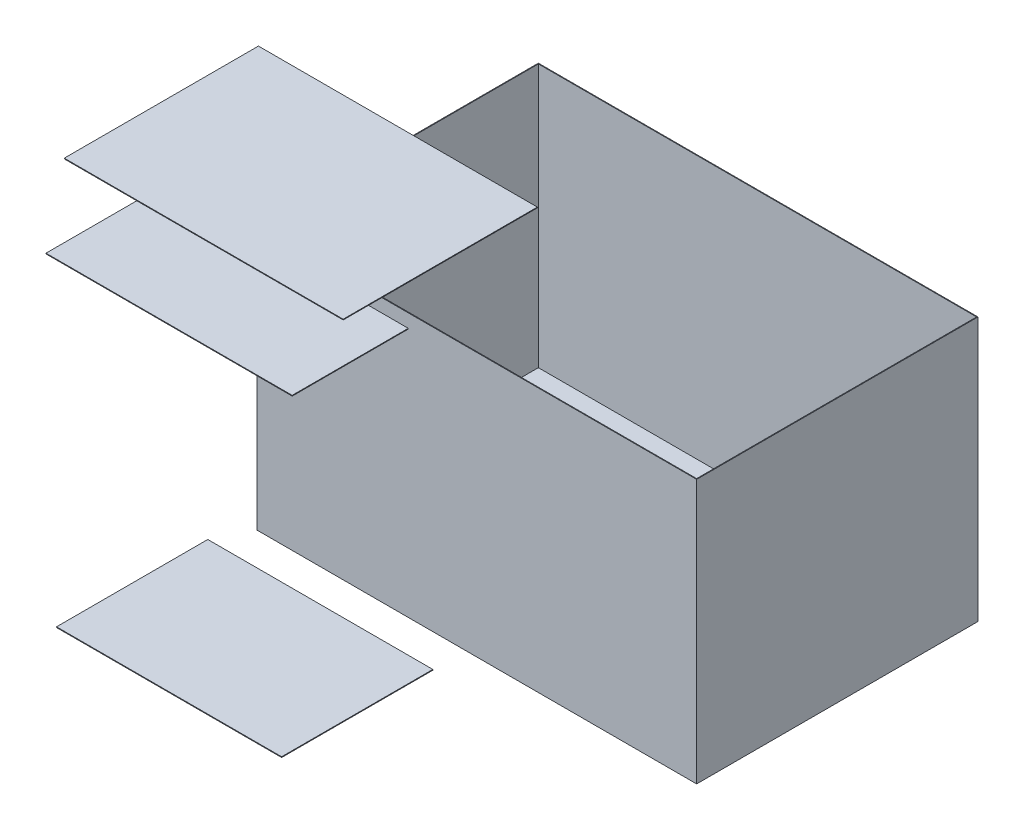
ISO-10303-21;
HEADER;
FILE_DESCRIPTION(('STEP AP214'),'2;1');
FILE_NAME('part.step','',(''),(''),'','','');
FILE_SCHEMA(('AUTOMOTIVE_DESIGN { 1 0 10303 214 1 1 1 1 }'));
ENDSEC;
DATA;
#1=APPLICATION_CONTEXT('core data for automotive mechanical design processes');
#2=APPLICATION_PROTOCOL_DEFINITION('international standard','automotive_design',2000,#1);
#3=PRODUCT_CONTEXT('',#1,'mechanical');
#4=PRODUCT('Part','Part','',(#3));
#5=PRODUCT_RELATED_PRODUCT_CATEGORY('part','',(#4));
#6=PRODUCT_DEFINITION_FORMATION('','',#4);
#7=PRODUCT_DEFINITION_CONTEXT('part definition',#1,'design');
#8=PRODUCT_DEFINITION('design','',#6,#7);
#9=PRODUCT_DEFINITION_SHAPE('','',#8);
#10=(LENGTH_UNIT() NAMED_UNIT(*) SI_UNIT(.MILLI.,.METRE.));
#11=(NAMED_UNIT(*) PLANE_ANGLE_UNIT() SI_UNIT($,.RADIAN.));
#12=(NAMED_UNIT(*) SI_UNIT($,.STERADIAN.) SOLID_ANGLE_UNIT());
#13=UNCERTAINTY_MEASURE_WITH_UNIT(LENGTH_MEASURE(1.E-05),#10,'distance_accuracy_value','');
#14=(GEOMETRIC_REPRESENTATION_CONTEXT(3) GLOBAL_UNCERTAINTY_ASSIGNED_CONTEXT((#13)) GLOBAL_UNIT_ASSIGNED_CONTEXT((#10,
#11,#12)) REPRESENTATION_CONTEXT('',''));
#15=CARTESIAN_POINT('',(0.,0.,0.));
#16=DIRECTION('',(0.,0.,1.));
#17=DIRECTION('',(1.,0.,0.));
#18=AXIS2_PLACEMENT_3D('',#15,#16,#17);
#19=CARTESIAN_POINT('',(2.,1192.,-2.));
#20=DIRECTION('',(1.,0.,0.));
#21=DIRECTION('',(0.,0.,-1.));
#22=AXIS2_PLACEMENT_3D('',#19,#20,#21);
#23=PLANE('',#22);
#24=DIRECTION('',(0.,0.,1.));
#25=VECTOR('',#24,1.);
#26=CARTESIAN_POINT('',(2.,1190.,-2.));
#27=LINE('',#26,#25);
#28=CARTESIAN_POINT('',(2.,1190.,-2.));
#29=VERTEX_POINT('',#28);
#30=CARTESIAN_POINT('',(2.,1190.,550.));
#31=VERTEX_POINT('',#30);
#32=EDGE_CURVE('E119',#29,#31,#27,.T.);
#33=ORIENTED_EDGE('',*,*,#32,.T.);
#34=DIRECTION('',(0.,-1.,0.));
#35=VECTOR('',#34,1.);
#36=CARTESIAN_POINT('',(2.,1192.,550.));
#37=LINE('',#36,#35);
#38=CARTESIAN_POINT('',(2.,1192.,550.));
#39=VERTEX_POINT('',#38);
#40=EDGE_CURVE('E12',#39,#31,#37,.T.);
#41=ORIENTED_EDGE('',*,*,#40,.F.);
#42=DIRECTION('',(0.,0.,1.));
#43=VECTOR('',#42,1.);
#44=CARTESIAN_POINT('',(2.,1192.,-2.));
#45=LINE('',#44,#43);
#46=CARTESIAN_POINT('',(2.,1192.,-2.));
#47=VERTEX_POINT('',#46);
#48=EDGE_CURVE('E104',#47,#39,#45,.T.);
#49=ORIENTED_EDGE('',*,*,#48,.F.);
#50=DIRECTION('',(0.,-1.,0.));
#51=VECTOR('',#50,1.);
#52=CARTESIAN_POINT('',(2.,1192.,-2.));
#53=LINE('',#52,#51);
#54=EDGE_CURVE('E114',#47,#29,#53,.T.);
#55=ORIENTED_EDGE('',*,*,#54,.T.);
#56=EDGE_LOOP('',(#33,#41,#49,#55));
#57=FACE_BOUND('',#56,.T.);
#58=ADVANCED_FACE('F53',(#57),#23,.F.);
#59=CARTESIAN_POINT('',(2.,1192.,550.));
#60=DIRECTION('',(0.,0.,-1.));
#61=DIRECTION('',(-1.,0.,0.));
#62=AXIS2_PLACEMENT_3D('',#59,#60,#61);
#63=PLANE('',#62);
#64=DIRECTION('',(1.,0.,0.));
#65=VECTOR('',#64,1.);
#66=CARTESIAN_POINT('',(2.,1190.,550.));
#67=LINE('',#66,#65);
#68=CARTESIAN_POINT('',(795.,1190.,550.));
#69=VERTEX_POINT('',#68);
#70=EDGE_CURVE('E108',#31,#69,#67,.T.);
#71=ORIENTED_EDGE('',*,*,#70,.T.);
#72=DIRECTION('',(0.,-1.,0.));
#73=VECTOR('',#72,1.);
#74=CARTESIAN_POINT('',(795.,1192.,550.));
#75=LINE('',#74,#73);
#76=CARTESIAN_POINT('',(795.,1192.,550.));
#77=VERTEX_POINT('',#76);
#78=EDGE_CURVE('E64',#77,#69,#75,.T.);
#79=ORIENTED_EDGE('',*,*,#78,.F.);
#80=DIRECTION('',(1.,0.,0.));
#81=VECTOR('',#80,1.);
#82=CARTESIAN_POINT('',(2.,1192.,550.));
#83=LINE('',#82,#81);
#84=EDGE_CURVE('E99',#39,#77,#83,.T.);
#85=ORIENTED_EDGE('',*,*,#84,.F.);
#86=ORIENTED_EDGE('',*,*,#40,.T.);
#87=EDGE_LOOP('',(#71,#79,#85,#86));
#88=FACE_BOUND('',#87,.T.);
#89=ADVANCED_FACE('F107',(#88),#63,.F.);
#90=CARTESIAN_POINT('',(795.,1192.,-2.));
#91=DIRECTION('',(-1.,0.,0.));
#92=DIRECTION('',(0.,0.,1.));
#93=AXIS2_PLACEMENT_3D('',#90,#91,#92);
#94=PLANE('',#93);
#95=DIRECTION('',(0.,0.,-1.));
#96=VECTOR('',#95,1.);
#97=CARTESIAN_POINT('',(795.,1190.,-2.));
#98=LINE('',#97,#96);
#99=CARTESIAN_POINT('',(795.,1190.,-2.));
#100=VERTEX_POINT('',#99);
#101=EDGE_CURVE('E87',#69,#100,#98,.T.);
#102=ORIENTED_EDGE('',*,*,#101,.T.);
#103=DIRECTION('',(0.,-1.,0.));
#104=VECTOR('',#103,1.);
#105=CARTESIAN_POINT('',(795.,1192.,-2.));
#106=LINE('',#105,#104);
#107=CARTESIAN_POINT('',(795.,1192.,-2.));
#108=VERTEX_POINT('',#107);
#109=EDGE_CURVE('E109',#108,#100,#106,.T.);
#110=ORIENTED_EDGE('',*,*,#109,.F.);
#111=DIRECTION('',(0.,0.,-1.));
#112=VECTOR('',#111,1.);
#113=CARTESIAN_POINT('',(795.,1192.,-2.));
#114=LINE('',#113,#112);
#115=EDGE_CURVE('E103',#77,#108,#114,.T.);
#116=ORIENTED_EDGE('',*,*,#115,.F.);
#117=ORIENTED_EDGE('',*,*,#78,.T.);
#118=EDGE_LOOP('',(#102,#110,#116,#117));
#119=FACE_BOUND('',#118,.T.);
#120=ADVANCED_FACE('F112',(#119),#94,.F.);
#121=CARTESIAN_POINT('',(2.,1192.,-2.));
#122=DIRECTION('',(0.,0.,1.));
#123=DIRECTION('',(1.,0.,0.));
#124=AXIS2_PLACEMENT_3D('',#121,#122,#123);
#125=PLANE('',#124);
#126=DIRECTION('',(-1.,0.,0.));
#127=VECTOR('',#126,1.);
#128=CARTESIAN_POINT('',(2.,1190.,-2.));
#129=LINE('',#128,#127);
#130=EDGE_CURVE('E91',#100,#29,#129,.T.);
#131=ORIENTED_EDGE('',*,*,#130,.T.);
#132=ORIENTED_EDGE('',*,*,#54,.F.);
#133=DIRECTION('',(-1.,0.,0.));
#134=VECTOR('',#133,1.);
#135=CARTESIAN_POINT('',(2.,1192.,-2.));
#136=LINE('',#135,#134);
#137=EDGE_CURVE('E67',#108,#47,#136,.T.);
#138=ORIENTED_EDGE('',*,*,#137,.F.);
#139=ORIENTED_EDGE('',*,*,#109,.T.);
#140=EDGE_LOOP('',(#131,#132,#138,#139));
#141=FACE_BOUND('',#140,.T.);
#142=ADVANCED_FACE('F123',(#141),#125,.F.);
#143=CARTESIAN_POINT('',(0.,1192.,0.));
#144=DIRECTION('',(0.,1.,0.));
#145=DIRECTION('',(0.,0.,1.));
#146=AXIS2_PLACEMENT_3D('',#143,#144,#145);
#147=PLANE('',#146);
#148=ORIENTED_EDGE('',*,*,#48,.T.);
#149=ORIENTED_EDGE('',*,*,#84,.T.);
#150=ORIENTED_EDGE('',*,*,#115,.T.);
#151=ORIENTED_EDGE('',*,*,#137,.T.);
#152=EDGE_LOOP('',(#148,#149,#150,#151));
#153=FACE_BOUND('',#152,.T.);
#154=ADVANCED_FACE('F101',(#153),#147,.T.);
#155=CARTESIAN_POINT('',(0.,1190.,0.));
#156=DIRECTION('',(0.,1.,0.));
#157=DIRECTION('',(0.,0.,1.));
#158=AXIS2_PLACEMENT_3D('',#155,#156,#157);
#159=PLANE('',#158);
#160=ORIENTED_EDGE('',*,*,#32,.F.);
#161=ORIENTED_EDGE('',*,*,#130,.F.);
#162=ORIENTED_EDGE('',*,*,#101,.F.);
#163=ORIENTED_EDGE('',*,*,#70,.F.);
#164=EDGE_LOOP('',(#160,#161,#162,#163));
#165=FACE_BOUND('',#164,.T.);
#166=ADVANCED_FACE('F130',(#165),#159,.F.);
#167=CLOSED_SHELL('',(#58,#89,#120,#142,#154,#166));
#168=MANIFOLD_SOLID_BREP('B2',#167);
#169=CARTESIAN_POINT('',(50.,1032.,320.));
#170=DIRECTION('',(1.,0.,0.));
#171=DIRECTION('',(0.,0.,-1.));
#172=AXIS2_PLACEMENT_3D('',#169,#170,#171);
#173=PLANE('',#172);
#174=DIRECTION('',(0.,0.,1.));
#175=VECTOR('',#174,1.);
#176=CARTESIAN_POINT('',(50.,1030.,320.));
#177=LINE('',#176,#175);
#178=CARTESIAN_POINT('',(50.,1030.,320.));
#179=VERTEX_POINT('',#178);
#180=CARTESIAN_POINT('',(50.,1030.,650.));
#181=VERTEX_POINT('',#180);
#182=EDGE_CURVE('E253',#179,#181,#177,.T.);
#183=ORIENTED_EDGE('',*,*,#182,.T.);
#184=DIRECTION('',(0.,-1.,0.));
#185=VECTOR('',#184,1.);
#186=CARTESIAN_POINT('',(50.,1032.,650.));
#187=LINE('',#186,#185);
#188=CARTESIAN_POINT('',(50.,1032.,650.));
#189=VERTEX_POINT('',#188);
#190=EDGE_CURVE('E55',#189,#181,#187,.T.);
#191=ORIENTED_EDGE('',*,*,#190,.F.);
#192=DIRECTION('',(0.,0.,1.));
#193=VECTOR('',#192,1.);
#194=CARTESIAN_POINT('',(50.,1032.,320.));
#195=LINE('',#194,#193);
#196=CARTESIAN_POINT('',(50.,1032.,320.));
#197=VERTEX_POINT('',#196);
#198=EDGE_CURVE('E239',#197,#189,#195,.T.);
#199=ORIENTED_EDGE('',*,*,#198,.F.);
#200=DIRECTION('',(0.,-1.,0.));
#201=VECTOR('',#200,1.);
#202=CARTESIAN_POINT('',(50.,1032.,320.));
#203=LINE('',#202,#201);
#204=EDGE_CURVE('E246',#197,#179,#203,.T.);
#205=ORIENTED_EDGE('',*,*,#204,.T.);
#206=EDGE_LOOP('',(#183,#191,#199,#205));
#207=FACE_BOUND('',#206,.T.);
#208=ADVANCED_FACE('F190',(#207),#173,.F.);
#209=CARTESIAN_POINT('',(50.,1032.,650.));
#210=DIRECTION('',(0.,0.,-1.));
#211=DIRECTION('',(-1.,0.,0.));
#212=AXIS2_PLACEMENT_3D('',#209,#210,#211);
#213=PLANE('',#212);
#214=DIRECTION('',(1.,0.,0.));
#215=VECTOR('',#214,1.);
#216=CARTESIAN_POINT('',(50.,1030.,650.));
#217=LINE('',#216,#215);
#218=CARTESIAN_POINT('',(750.,1030.,650.));
#219=VERTEX_POINT('',#218);
#220=EDGE_CURVE('E245',#181,#219,#217,.T.);
#221=ORIENTED_EDGE('',*,*,#220,.T.);
#222=DIRECTION('',(0.,-1.,0.));
#223=VECTOR('',#222,1.);
#224=CARTESIAN_POINT('',(750.,1032.,650.));
#225=LINE('',#224,#223);
#226=CARTESIAN_POINT('',(750.,1032.,650.));
#227=VERTEX_POINT('',#226);
#228=EDGE_CURVE('E198',#227,#219,#225,.T.);
#229=ORIENTED_EDGE('',*,*,#228,.F.);
#230=DIRECTION('',(1.,0.,0.));
#231=VECTOR('',#230,1.);
#232=CARTESIAN_POINT('',(50.,1032.,650.));
#233=LINE('',#232,#231);
#234=EDGE_CURVE('E233',#189,#227,#233,.T.);
#235=ORIENTED_EDGE('',*,*,#234,.F.);
#236=ORIENTED_EDGE('',*,*,#190,.T.);
#237=EDGE_LOOP('',(#221,#229,#235,#236));
#238=FACE_BOUND('',#237,.T.);
#239=ADVANCED_FACE('F244',(#238),#213,.F.);
#240=CARTESIAN_POINT('',(750.,1032.,320.));
#241=DIRECTION('',(-1.,0.,0.));
#242=DIRECTION('',(0.,0.,1.));
#243=AXIS2_PLACEMENT_3D('',#240,#241,#242);
#244=PLANE('',#243);
#245=DIRECTION('',(0.,0.,-1.));
#246=VECTOR('',#245,1.);
#247=CARTESIAN_POINT('',(750.,1030.,320.));
#248=LINE('',#247,#246);
#249=CARTESIAN_POINT('',(750.,1030.,320.));
#250=VERTEX_POINT('',#249);
#251=EDGE_CURVE('E222',#219,#250,#248,.T.);
#252=ORIENTED_EDGE('',*,*,#251,.T.);
#253=DIRECTION('',(0.,-1.,0.));
#254=VECTOR('',#253,1.);
#255=CARTESIAN_POINT('',(750.,1032.,320.));
#256=LINE('',#255,#254);
#257=CARTESIAN_POINT('',(750.,1032.,320.));
#258=VERTEX_POINT('',#257);
#259=EDGE_CURVE('E241',#258,#250,#256,.T.);
#260=ORIENTED_EDGE('',*,*,#259,.F.);
#261=DIRECTION('',(0.,0.,-1.));
#262=VECTOR('',#261,1.);
#263=CARTESIAN_POINT('',(750.,1032.,320.));
#264=LINE('',#263,#262);
#265=EDGE_CURVE('E240',#227,#258,#264,.T.);
#266=ORIENTED_EDGE('',*,*,#265,.F.);
#267=ORIENTED_EDGE('',*,*,#228,.T.);
#268=EDGE_LOOP('',(#252,#260,#266,#267));
#269=FACE_BOUND('',#268,.T.);
#270=ADVANCED_FACE('F243',(#269),#244,.F.);
#271=CARTESIAN_POINT('',(50.,1032.,320.));
#272=DIRECTION('',(0.,0.,1.));
#273=DIRECTION('',(1.,0.,0.));
#274=AXIS2_PLACEMENT_3D('',#271,#272,#273);
#275=PLANE('',#274);
#276=DIRECTION('',(-1.,0.,0.));
#277=VECTOR('',#276,1.);
#278=CARTESIAN_POINT('',(50.,1030.,320.));
#279=LINE('',#278,#277);
#280=EDGE_CURVE('E229',#250,#179,#279,.T.);
#281=ORIENTED_EDGE('',*,*,#280,.T.);
#282=ORIENTED_EDGE('',*,*,#204,.F.);
#283=DIRECTION('',(-1.,0.,0.));
#284=VECTOR('',#283,1.);
#285=CARTESIAN_POINT('',(50.,1032.,320.));
#286=LINE('',#285,#284);
#287=EDGE_CURVE('E204',#258,#197,#286,.T.);
#288=ORIENTED_EDGE('',*,*,#287,.F.);
#289=ORIENTED_EDGE('',*,*,#259,.T.);
#290=EDGE_LOOP('',(#281,#282,#288,#289));
#291=FACE_BOUND('',#290,.T.);
#292=ADVANCED_FACE('F256',(#291),#275,.F.);
#293=CARTESIAN_POINT('',(0.,1032.,0.));
#294=DIRECTION('',(0.,1.,0.));
#295=DIRECTION('',(0.,0.,1.));
#296=AXIS2_PLACEMENT_3D('',#293,#294,#295);
#297=PLANE('',#296);
#298=ORIENTED_EDGE('',*,*,#198,.T.);
#299=ORIENTED_EDGE('',*,*,#234,.T.);
#300=ORIENTED_EDGE('',*,*,#265,.T.);
#301=ORIENTED_EDGE('',*,*,#287,.T.);
#302=EDGE_LOOP('',(#298,#299,#300,#301));
#303=FACE_BOUND('',#302,.T.);
#304=ADVANCED_FACE('F232',(#303),#297,.T.);
#305=CARTESIAN_POINT('',(0.,1030.,0.));
#306=DIRECTION('',(0.,1.,0.));
#307=DIRECTION('',(0.,0.,1.));
#308=AXIS2_PLACEMENT_3D('',#305,#306,#307);
#309=PLANE('',#308);
#310=ORIENTED_EDGE('',*,*,#182,.F.);
#311=ORIENTED_EDGE('',*,*,#280,.F.);
#312=ORIENTED_EDGE('',*,*,#251,.F.);
#313=ORIENTED_EDGE('',*,*,#220,.F.);
#314=EDGE_LOOP('',(#310,#311,#312,#313));
#315=FACE_BOUND('',#314,.T.);
#316=ADVANCED_FACE('F261',(#315),#309,.F.);
#317=CLOSED_SHELL('',(#208,#239,#270,#292,#304,#316));
#318=MANIFOLD_SOLID_BREP('B6',#317);
#319=CARTESIAN_POINT('',(80.,127.,220.));
#320=DIRECTION('',(1.,0.,0.));
#321=DIRECTION('',(0.,0.,-1.));
#322=AXIS2_PLACEMENT_3D('',#319,#320,#321);
#323=PLANE('',#322);
#324=DIRECTION('',(0.,0.,1.));
#325=VECTOR('',#324,1.);
#326=CARTESIAN_POINT('',(80.,125.,220.));
#327=LINE('',#326,#325);
#328=CARTESIAN_POINT('',(80.,125.,220.));
#329=VERTEX_POINT('',#328);
#330=CARTESIAN_POINT('',(80.,125.,650.));
#331=VERTEX_POINT('',#330);
#332=EDGE_CURVE('E383',#329,#331,#327,.T.);
#333=ORIENTED_EDGE('',*,*,#332,.T.);
#334=DIRECTION('',(0.,-1.,0.));
#335=VECTOR('',#334,1.);
#336=CARTESIAN_POINT('',(80.,127.,650.));
#337=LINE('',#336,#335);
#338=CARTESIAN_POINT('',(80.,127.,650.));
#339=VERTEX_POINT('',#338);
#340=EDGE_CURVE('E187',#339,#331,#337,.T.);
#341=ORIENTED_EDGE('',*,*,#340,.F.);
#342=DIRECTION('',(0.,0.,1.));
#343=VECTOR('',#342,1.);
#344=CARTESIAN_POINT('',(80.,127.,220.));
#345=LINE('',#344,#343);
#346=CARTESIAN_POINT('',(80.,127.,220.));
#347=VERTEX_POINT('',#346);
#348=EDGE_CURVE('E375',#347,#339,#345,.T.);
#349=ORIENTED_EDGE('',*,*,#348,.F.);
#350=DIRECTION('',(0.,-1.,0.));
#351=VECTOR('',#350,1.);
#352=CARTESIAN_POINT('',(80.,127.,220.));
#353=LINE('',#352,#351);
#354=EDGE_CURVE('E379',#347,#329,#353,.T.);
#355=ORIENTED_EDGE('',*,*,#354,.T.);
#356=EDGE_LOOP('',(#333,#341,#349,#355));
#357=FACE_BOUND('',#356,.T.);
#358=ADVANCED_FACE('F321',(#357),#323,.F.);
#359=CARTESIAN_POINT('',(80.,127.,650.));
#360=DIRECTION('',(0.,0.,-1.));
#361=DIRECTION('',(-1.,0.,0.));
#362=AXIS2_PLACEMENT_3D('',#359,#360,#361);
#363=PLANE('',#362);
#364=DIRECTION('',(1.,0.,0.));
#365=VECTOR('',#364,1.);
#366=CARTESIAN_POINT('',(80.,125.,650.));
#367=LINE('',#366,#365);
#368=CARTESIAN_POINT('',(720.,125.,650.));
#369=VERTEX_POINT('',#368);
#370=EDGE_CURVE('E376',#331,#369,#367,.T.);
#371=ORIENTED_EDGE('',*,*,#370,.T.);
#372=DIRECTION('',(0.,-1.,0.));
#373=VECTOR('',#372,1.);
#374=CARTESIAN_POINT('',(720.,127.,650.));
#375=LINE('',#374,#373);
#376=CARTESIAN_POINT('',(720.,127.,650.));
#377=VERTEX_POINT('',#376);
#378=EDGE_CURVE('E328',#377,#369,#375,.T.);
#379=ORIENTED_EDGE('',*,*,#378,.F.);
#380=DIRECTION('',(1.,0.,0.));
#381=VECTOR('',#380,1.);
#382=CARTESIAN_POINT('',(80.,127.,650.));
#383=LINE('',#382,#381);
#384=EDGE_CURVE('E370',#339,#377,#383,.T.);
#385=ORIENTED_EDGE('',*,*,#384,.F.);
#386=ORIENTED_EDGE('',*,*,#340,.T.);
#387=EDGE_LOOP('',(#371,#379,#385,#386));
#388=FACE_BOUND('',#387,.T.);
#389=ADVANCED_FACE('F374',(#388),#363,.F.);
#390=CARTESIAN_POINT('',(720.,127.,220.));
#391=DIRECTION('',(-1.,0.,0.));
#392=DIRECTION('',(0.,0.,1.));
#393=AXIS2_PLACEMENT_3D('',#390,#391,#392);
#394=PLANE('',#393);
#395=DIRECTION('',(0.,0.,-1.));
#396=VECTOR('',#395,1.);
#397=CARTESIAN_POINT('',(720.,125.,220.));
#398=LINE('',#397,#396);
#399=CARTESIAN_POINT('',(720.,125.,220.));
#400=VERTEX_POINT('',#399);
#401=EDGE_CURVE('E351',#369,#400,#398,.T.);
#402=ORIENTED_EDGE('',*,*,#401,.T.);
#403=DIRECTION('',(0.,-1.,0.));
#404=VECTOR('',#403,1.);
#405=CARTESIAN_POINT('',(720.,127.,220.));
#406=LINE('',#405,#404);
#407=CARTESIAN_POINT('',(720.,127.,220.));
#408=VERTEX_POINT('',#407);
#409=EDGE_CURVE('E380',#408,#400,#406,.T.);
#410=ORIENTED_EDGE('',*,*,#409,.F.);
#411=DIRECTION('',(0.,0.,-1.));
#412=VECTOR('',#411,1.);
#413=CARTESIAN_POINT('',(720.,127.,220.));
#414=LINE('',#413,#412);
#415=EDGE_CURVE('E367',#377,#408,#414,.T.);
#416=ORIENTED_EDGE('',*,*,#415,.F.);
#417=ORIENTED_EDGE('',*,*,#378,.T.);
#418=EDGE_LOOP('',(#402,#410,#416,#417));
#419=FACE_BOUND('',#418,.T.);
#420=ADVANCED_FACE('F378',(#419),#394,.F.);
#421=CARTESIAN_POINT('',(80.,127.,220.));
#422=DIRECTION('',(0.,0.,1.));
#423=DIRECTION('',(1.,0.,0.));
#424=AXIS2_PLACEMENT_3D('',#421,#422,#423);
#425=PLANE('',#424);
#426=DIRECTION('',(-1.,0.,0.));
#427=VECTOR('',#426,1.);
#428=CARTESIAN_POINT('',(80.,125.,220.));
#429=LINE('',#428,#427);
#430=EDGE_CURVE('E357',#400,#329,#429,.T.);
#431=ORIENTED_EDGE('',*,*,#430,.T.);
#432=ORIENTED_EDGE('',*,*,#354,.F.);
#433=DIRECTION('',(-1.,0.,0.));
#434=VECTOR('',#433,1.);
#435=CARTESIAN_POINT('',(80.,127.,220.));
#436=LINE('',#435,#434);
#437=EDGE_CURVE('E339',#408,#347,#436,.T.);
#438=ORIENTED_EDGE('',*,*,#437,.F.);
#439=ORIENTED_EDGE('',*,*,#409,.T.);
#440=EDGE_LOOP('',(#431,#432,#438,#439));
#441=FACE_BOUND('',#440,.T.);
#442=ADVANCED_FACE('F392',(#441),#425,.F.);
#443=CARTESIAN_POINT('',(0.,127.,0.));
#444=DIRECTION('',(0.,1.,0.));
#445=DIRECTION('',(0.,0.,1.));
#446=AXIS2_PLACEMENT_3D('',#443,#444,#445);
#447=PLANE('',#446);
#448=ORIENTED_EDGE('',*,*,#348,.T.);
#449=ORIENTED_EDGE('',*,*,#384,.T.);
#450=ORIENTED_EDGE('',*,*,#415,.T.);
#451=ORIENTED_EDGE('',*,*,#437,.T.);
#452=EDGE_LOOP('',(#448,#449,#450,#451));
#453=FACE_BOUND('',#452,.T.);
#454=ADVANCED_FACE('F366',(#453),#447,.T.);
#455=CARTESIAN_POINT('',(0.,125.,0.));
#456=DIRECTION('',(0.,1.,0.));
#457=DIRECTION('',(0.,0.,1.));
#458=AXIS2_PLACEMENT_3D('',#455,#456,#457);
#459=PLANE('',#458);
#460=ORIENTED_EDGE('',*,*,#332,.F.);
#461=ORIENTED_EDGE('',*,*,#430,.F.);
#462=ORIENTED_EDGE('',*,*,#401,.F.);
#463=ORIENTED_EDGE('',*,*,#370,.F.);
#464=EDGE_LOOP('',(#460,#461,#462,#463));
#465=FACE_BOUND('',#464,.T.);
#466=ADVANCED_FACE('F391',(#465),#459,.F.);
#467=CLOSED_SHELL('',(#358,#389,#420,#442,#454,#466));
#468=MANIFOLD_SOLID_BREP('B46',#467);
#469=CARTESIAN_POINT('',(0.,750.,0.));
#470=DIRECTION('',(0.,-1.,0.));
#471=DIRECTION('',(0.,0.,-1.));
#472=AXIS2_PLACEMENT_3D('',#469,#470,#471);
#473=PLANE('',#472);
#474=DIRECTION('',(0.,0.,1.));
#475=VECTOR('',#474,1.);
#476=CARTESIAN_POINT('',(0.,750.,0.));
#477=LINE('',#476,#475);
#478=CARTESIAN_POINT('',(0.,750.,-800.));
#479=VERTEX_POINT('',#478);
#480=CARTESIAN_POINT('',(0.,750.,0.));
#481=VERTEX_POINT('',#480);
#482=EDGE_CURVE('E554',#479,#481,#477,.T.);
#483=ORIENTED_EDGE('',*,*,#482,.T.);
#484=DIRECTION('',(1.,0.,0.));
#485=VECTOR('',#484,1.);
#486=CARTESIAN_POINT('',(0.,750.,0.));
#487=LINE('',#486,#485);
#488=CARTESIAN_POINT('',(1250.,750.,0.));
#489=VERTEX_POINT('',#488);
#490=EDGE_CURVE('E500',#481,#489,#487,.T.);
#491=ORIENTED_EDGE('',*,*,#490,.T.);
#492=DIRECTION('',(0.,0.,-1.));
#493=VECTOR('',#492,1.);
#494=CARTESIAN_POINT('',(1250.,750.,0.));
#495=LINE('',#494,#493);
#496=CARTESIAN_POINT('',(1250.,750.,-800.));
#497=VERTEX_POINT('',#496);
#498=EDGE_CURVE('E557',#489,#497,#495,.T.);
#499=ORIENTED_EDGE('',*,*,#498,.T.);
#500=DIRECTION('',(-1.,0.,0.));
#501=VECTOR('',#500,1.);
#502=CARTESIAN_POINT('',(0.,750.,-800.));
#503=LINE('',#502,#501);
#504=EDGE_CURVE('E468',#497,#479,#503,.T.);
#505=ORIENTED_EDGE('',*,*,#504,.T.);
#506=EDGE_LOOP('',(#483,#491,#499,#505));
#507=FACE_BOUND('',#506,.T.);
#508=DIRECTION('',(0.,0.,1.));
#509=VECTOR('',#508,1.);
#510=CARTESIAN_POINT('',(2.,750.,0.));
#511=LINE('',#510,#509);
#512=CARTESIAN_POINT('',(2.,750.,-798.));
#513=VERTEX_POINT('',#512);
#514=CARTESIAN_POINT('',(2.,750.,-2.));
#515=VERTEX_POINT('',#514);
#516=EDGE_CURVE('E545',#513,#515,#511,.T.);
#517=ORIENTED_EDGE('',*,*,#516,.F.);
#518=DIRECTION('',(-1.,0.,0.));
#519=VECTOR('',#518,1.);
#520=CARTESIAN_POINT('',(0.,750.,-798.));
#521=LINE('',#520,#519);
#522=CARTESIAN_POINT('',(1248.,750.,-798.));
#523=VERTEX_POINT('',#522);
#524=EDGE_CURVE('E552',#523,#513,#521,.T.);
#525=ORIENTED_EDGE('',*,*,#524,.F.);
#526=DIRECTION('',(0.,0.,-1.));
#527=VECTOR('',#526,1.);
#528=CARTESIAN_POINT('',(1248.,750.,0.));
#529=LINE('',#528,#527);
#530=CARTESIAN_POINT('',(1248.,750.,-2.));
#531=VERTEX_POINT('',#530);
#532=EDGE_CURVE('E548',#531,#523,#529,.T.);
#533=ORIENTED_EDGE('',*,*,#532,.F.);
#534=DIRECTION('',(1.,0.,0.));
#535=VECTOR('',#534,1.);
#536=CARTESIAN_POINT('',(0.,750.,-2.));
#537=LINE('',#536,#535);
#538=EDGE_CURVE('E534',#515,#531,#537,.T.);
#539=ORIENTED_EDGE('',*,*,#538,.F.);
#540=EDGE_LOOP('',(#517,#525,#533,#539));
#541=FACE_BOUND('',#540,.T.);
#542=ADVANCED_FACE('F443',(#507,#541),#473,.F.);
#543=CARTESIAN_POINT('',(0.,750.,0.));
#544=DIRECTION('',(1.,0.,0.));
#545=DIRECTION('',(0.,0.,-1.));
#546=AXIS2_PLACEMENT_3D('',#543,#544,#545);
#547=PLANE('',#546);
#548=DIRECTION('',(0.,0.,1.));
#549=VECTOR('',#548,1.);
#550=CARTESIAN_POINT('',(0.,0.,0.));
#551=LINE('',#550,#549);
#552=CARTESIAN_POINT('',(0.,0.,-800.));
#553=VERTEX_POINT('',#552);
#554=CARTESIAN_POINT('',(0.,0.,0.));
#555=VERTEX_POINT('',#554);
#556=EDGE_CURVE('E558',#553,#555,#551,.T.);
#557=ORIENTED_EDGE('',*,*,#556,.T.);
#558=DIRECTION('',(0.,-1.,0.));
#559=VECTOR('',#558,1.);
#560=CARTESIAN_POINT('',(0.,750.,0.));
#561=LINE('',#560,#559);
#562=EDGE_CURVE('E317',#481,#555,#561,.T.);
#563=ORIENTED_EDGE('',*,*,#562,.F.);
#564=ORIENTED_EDGE('',*,*,#482,.F.);
#565=DIRECTION('',(0.,-1.,0.));
#566=VECTOR('',#565,1.);
#567=CARTESIAN_POINT('',(0.,750.,-800.));
#568=LINE('',#567,#566);
#569=EDGE_CURVE('E556',#479,#553,#568,.T.);
#570=ORIENTED_EDGE('',*,*,#569,.T.);
#571=EDGE_LOOP('',(#557,#563,#564,#570));
#572=FACE_BOUND('',#571,.T.);
#573=ADVANCED_FACE('F449',(#572),#547,.F.);
#574=CARTESIAN_POINT('',(0.,750.,0.));
#575=DIRECTION('',(0.,0.,-1.));
#576=DIRECTION('',(-1.,0.,0.));
#577=AXIS2_PLACEMENT_3D('',#574,#575,#576);
#578=PLANE('',#577);
#579=DIRECTION('',(1.,0.,0.));
#580=VECTOR('',#579,1.);
#581=CARTESIAN_POINT('',(0.,0.,0.));
#582=LINE('',#581,#580);
#583=CARTESIAN_POINT('',(1250.,0.,0.));
#584=VERTEX_POINT('',#583);
#585=EDGE_CURVE('E565',#555,#584,#582,.T.);
#586=ORIENTED_EDGE('',*,*,#585,.T.);
#587=DIRECTION('',(0.,-1.,0.));
#588=VECTOR('',#587,1.);
#589=CARTESIAN_POINT('',(1250.,750.,0.));
#590=LINE('',#589,#588);
#591=EDGE_CURVE('E455',#489,#584,#590,.T.);
#592=ORIENTED_EDGE('',*,*,#591,.F.);
#593=ORIENTED_EDGE('',*,*,#490,.F.);
#594=ORIENTED_EDGE('',*,*,#562,.T.);
#595=EDGE_LOOP('',(#586,#592,#593,#594));
#596=FACE_BOUND('',#595,.T.);
#597=ADVANCED_FACE('F591',(#596),#578,.F.);
#598=CARTESIAN_POINT('',(1250.,750.,0.));
#599=DIRECTION('',(-1.,0.,0.));
#600=DIRECTION('',(0.,0.,1.));
#601=AXIS2_PLACEMENT_3D('',#598,#599,#600);
#602=PLANE('',#601);
#603=DIRECTION('',(0.,0.,-1.));
#604=VECTOR('',#603,1.);
#605=CARTESIAN_POINT('',(1250.,0.,0.));
#606=LINE('',#605,#604);
#607=CARTESIAN_POINT('',(1250.,0.,-800.));
#608=VERTEX_POINT('',#607);
#609=EDGE_CURVE('E562',#584,#608,#606,.T.);
#610=ORIENTED_EDGE('',*,*,#609,.T.);
#611=DIRECTION('',(0.,-1.,0.));
#612=VECTOR('',#611,1.);
#613=CARTESIAN_POINT('',(1250.,750.,-800.));
#614=LINE('',#613,#612);
#615=EDGE_CURVE('E569',#497,#608,#614,.T.);
#616=ORIENTED_EDGE('',*,*,#615,.F.);
#617=ORIENTED_EDGE('',*,*,#498,.F.);
#618=ORIENTED_EDGE('',*,*,#591,.T.);
#619=EDGE_LOOP('',(#610,#616,#617,#618));
#620=FACE_BOUND('',#619,.T.);
#621=ADVANCED_FACE('F571',(#620),#602,.F.);
#622=CARTESIAN_POINT('',(0.,750.,-800.));
#623=DIRECTION('',(0.,0.,1.));
#624=DIRECTION('',(1.,0.,0.));
#625=AXIS2_PLACEMENT_3D('',#622,#623,#624);
#626=PLANE('',#625);
#627=DIRECTION('',(-1.,0.,0.));
#628=VECTOR('',#627,1.);
#629=CARTESIAN_POINT('',(0.,0.,-800.));
#630=LINE('',#629,#628);
#631=EDGE_CURVE('E489',#608,#553,#630,.T.);
#632=ORIENTED_EDGE('',*,*,#631,.T.);
#633=ORIENTED_EDGE('',*,*,#569,.F.);
#634=ORIENTED_EDGE('',*,*,#504,.F.);
#635=ORIENTED_EDGE('',*,*,#615,.T.);
#636=EDGE_LOOP('',(#632,#633,#634,#635));
#637=FACE_BOUND('',#636,.T.);
#638=ADVANCED_FACE('F582',(#637),#626,.F.);
#639=CARTESIAN_POINT('',(0.,0.,0.));
#640=DIRECTION('',(0.,-1.,0.));
#641=DIRECTION('',(0.,0.,-1.));
#642=AXIS2_PLACEMENT_3D('',#639,#640,#641);
#643=PLANE('',#642);
#644=ORIENTED_EDGE('',*,*,#556,.F.);
#645=ORIENTED_EDGE('',*,*,#631,.F.);
#646=ORIENTED_EDGE('',*,*,#609,.F.);
#647=ORIENTED_EDGE('',*,*,#585,.F.);
#648=EDGE_LOOP('',(#644,#645,#646,#647));
#649=FACE_BOUND('',#648,.T.);
#650=ADVANCED_FACE('F580',(#649),#643,.T.);
#651=CARTESIAN_POINT('',(2.,750.,0.));
#652=DIRECTION('',(1.,0.,0.));
#653=DIRECTION('',(0.,0.,-1.));
#654=AXIS2_PLACEMENT_3D('',#651,#652,#653);
#655=PLANE('',#654);
#656=DIRECTION('',(0.,0.,1.));
#657=VECTOR('',#656,1.);
#658=CARTESIAN_POINT('',(2.,2.,0.));
#659=LINE('',#658,#657);
#660=CARTESIAN_POINT('',(2.,2.,-798.));
#661=VERTEX_POINT('',#660);
#662=CARTESIAN_POINT('',(2.,2.,-2.));
#663=VERTEX_POINT('',#662);
#664=EDGE_CURVE('E522',#661,#663,#659,.T.);
#665=ORIENTED_EDGE('',*,*,#664,.F.);
#666=DIRECTION('',(0.,-1.,0.));
#667=VECTOR('',#666,1.);
#668=CARTESIAN_POINT('',(2.,750.,-798.));
#669=LINE('',#668,#667);
#670=EDGE_CURVE('E544',#513,#661,#669,.T.);
#671=ORIENTED_EDGE('',*,*,#670,.F.);
#672=ORIENTED_EDGE('',*,*,#516,.T.);
#673=DIRECTION('',(0.,-1.,0.));
#674=VECTOR('',#673,1.);
#675=CARTESIAN_POINT('',(2.,750.,-2.));
#676=LINE('',#675,#674);
#677=EDGE_CURVE('E540',#515,#663,#676,.T.);
#678=ORIENTED_EDGE('',*,*,#677,.T.);
#679=EDGE_LOOP('',(#665,#671,#672,#678));
#680=FACE_BOUND('',#679,.T.);
#681=ADVANCED_FACE('F589',(#680),#655,.T.);
#682=CARTESIAN_POINT('',(0.,750.,-2.));
#683=DIRECTION('',(0.,0.,-1.));
#684=DIRECTION('',(-1.,0.,0.));
#685=AXIS2_PLACEMENT_3D('',#682,#683,#684);
#686=PLANE('',#685);
#687=DIRECTION('',(1.,0.,0.));
#688=VECTOR('',#687,1.);
#689=CARTESIAN_POINT('',(0.,2.,-2.));
#690=LINE('',#689,#688);
#691=CARTESIAN_POINT('',(1248.,2.,-2.));
#692=VERTEX_POINT('',#691);
#693=EDGE_CURVE('E516',#663,#692,#690,.T.);
#694=ORIENTED_EDGE('',*,*,#693,.F.);
#695=ORIENTED_EDGE('',*,*,#677,.F.);
#696=ORIENTED_EDGE('',*,*,#538,.T.);
#697=DIRECTION('',(0.,-1.,0.));
#698=VECTOR('',#697,1.);
#699=CARTESIAN_POINT('',(1248.,750.,-2.));
#700=LINE('',#699,#698);
#701=EDGE_CURVE('E533',#531,#692,#700,.T.);
#702=ORIENTED_EDGE('',*,*,#701,.T.);
#703=EDGE_LOOP('',(#694,#695,#696,#702));
#704=FACE_BOUND('',#703,.T.);
#705=ADVANCED_FACE('F535',(#704),#686,.T.);
#706=CARTESIAN_POINT('',(1248.,750.,0.));
#707=DIRECTION('',(-1.,0.,0.));
#708=DIRECTION('',(0.,0.,1.));
#709=AXIS2_PLACEMENT_3D('',#706,#707,#708);
#710=PLANE('',#709);
#711=DIRECTION('',(0.,0.,-1.));
#712=VECTOR('',#711,1.);
#713=CARTESIAN_POINT('',(1248.,2.,0.));
#714=LINE('',#713,#712);
#715=CARTESIAN_POINT('',(1248.,2.,-798.));
#716=VERTEX_POINT('',#715);
#717=EDGE_CURVE('E525',#692,#716,#714,.T.);
#718=ORIENTED_EDGE('',*,*,#717,.F.);
#719=ORIENTED_EDGE('',*,*,#701,.F.);
#720=ORIENTED_EDGE('',*,*,#532,.T.);
#721=DIRECTION('',(0.,-1.,0.));
#722=VECTOR('',#721,1.);
#723=CARTESIAN_POINT('',(1248.,750.,-798.));
#724=LINE('',#723,#722);
#725=EDGE_CURVE('E458',#523,#716,#724,.T.);
#726=ORIENTED_EDGE('',*,*,#725,.T.);
#727=EDGE_LOOP('',(#718,#719,#720,#726));
#728=FACE_BOUND('',#727,.T.);
#729=ADVANCED_FACE('F537',(#728),#710,.T.);
#730=CARTESIAN_POINT('',(0.,750.,-798.));
#731=DIRECTION('',(0.,0.,1.));
#732=DIRECTION('',(1.,0.,0.));
#733=AXIS2_PLACEMENT_3D('',#730,#731,#732);
#734=PLANE('',#733);
#735=DIRECTION('',(-1.,0.,0.));
#736=VECTOR('',#735,1.);
#737=CARTESIAN_POINT('',(0.,2.,-798.));
#738=LINE('',#737,#736);
#739=EDGE_CURVE('E539',#716,#661,#738,.T.);
#740=ORIENTED_EDGE('',*,*,#739,.F.);
#741=ORIENTED_EDGE('',*,*,#725,.F.);
#742=ORIENTED_EDGE('',*,*,#524,.T.);
#743=ORIENTED_EDGE('',*,*,#670,.T.);
#744=EDGE_LOOP('',(#740,#741,#742,#743));
#745=FACE_BOUND('',#744,.T.);
#746=ADVANCED_FACE('F602',(#745),#734,.T.);
#747=CARTESIAN_POINT('',(0.,2.,0.));
#748=DIRECTION('',(0.,-1.,0.));
#749=DIRECTION('',(0.,0.,-1.));
#750=AXIS2_PLACEMENT_3D('',#747,#748,#749);
#751=PLANE('',#750);
#752=ORIENTED_EDGE('',*,*,#664,.T.);
#753=ORIENTED_EDGE('',*,*,#693,.T.);
#754=ORIENTED_EDGE('',*,*,#717,.T.);
#755=ORIENTED_EDGE('',*,*,#739,.T.);
#756=EDGE_LOOP('',(#752,#753,#754,#755));
#757=FACE_BOUND('',#756,.T.);
#758=ADVANCED_FACE('F524',(#757),#751,.F.);
#759=CLOSED_SHELL('',(#542,#573,#597,#621,#638,#650,#681,#705,#729,#746,#758));
#760=MANIFOLD_SOLID_BREP('B177',#759);
#761=ADVANCED_BREP_SHAPE_REPRESENTATION('',(#18,#168,#318,#468,#760),#14);
#762=SHAPE_DEFINITION_REPRESENTATION(#9,#761);
ENDSEC;
END-ISO-10303-21;
